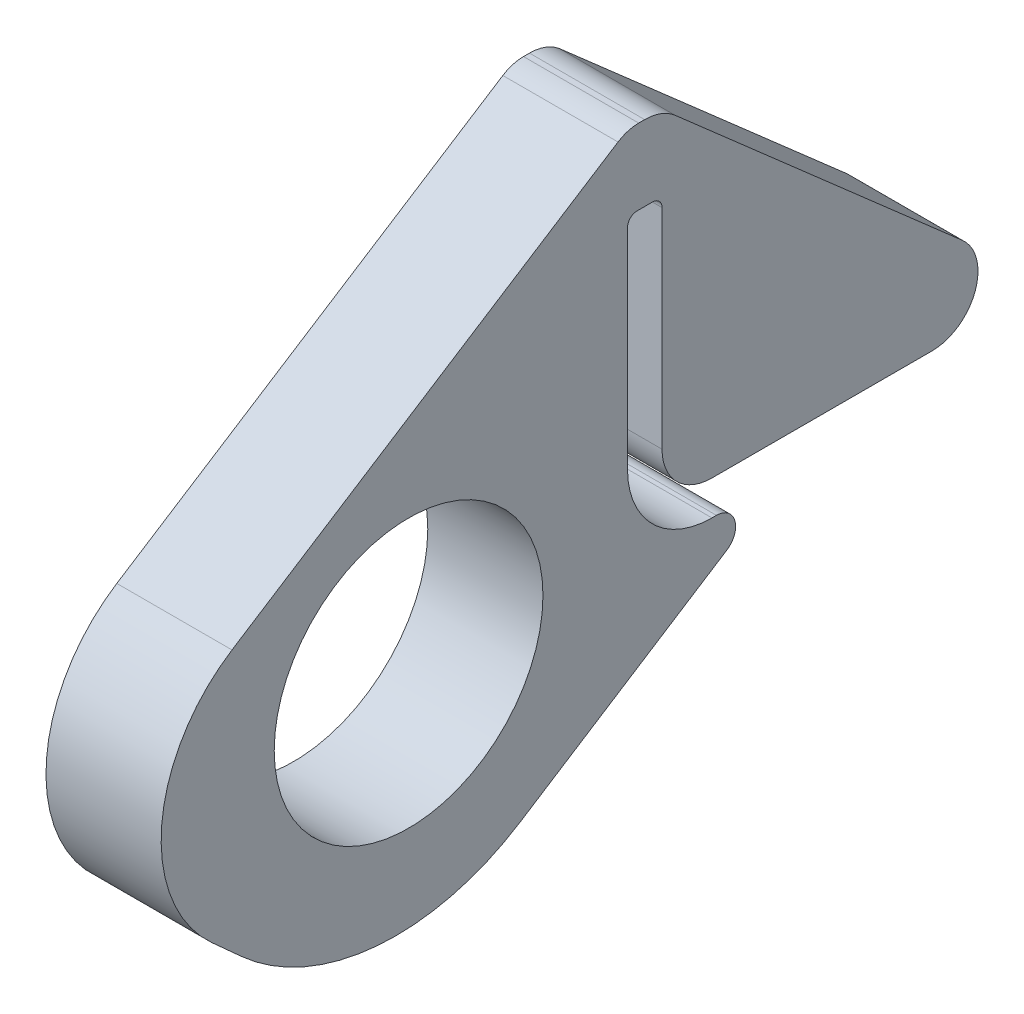
ISO-10303-21;
HEADER;
FILE_DESCRIPTION(('STEP AP214'),'2;1');
FILE_NAME('part.step','',(''),(''),'','','');
FILE_SCHEMA(('AUTOMOTIVE_DESIGN { 1 0 10303 214 1 1 1 1 }'));
ENDSEC;
DATA;
#1=APPLICATION_CONTEXT('core data for automotive mechanical design processes');
#2=APPLICATION_PROTOCOL_DEFINITION('international standard','automotive_design',2000,#1);
#3=PRODUCT_CONTEXT('',#1,'mechanical');
#4=PRODUCT('Part','Part','',(#3));
#5=PRODUCT_RELATED_PRODUCT_CATEGORY('part','',(#4));
#6=PRODUCT_DEFINITION_FORMATION('','',#4);
#7=PRODUCT_DEFINITION_CONTEXT('part definition',#1,'design');
#8=PRODUCT_DEFINITION('design','',#6,#7);
#9=PRODUCT_DEFINITION_SHAPE('','',#8);
#10=(LENGTH_UNIT() NAMED_UNIT(*) SI_UNIT(.MILLI.,.METRE.));
#11=(NAMED_UNIT(*) PLANE_ANGLE_UNIT() SI_UNIT($,.RADIAN.));
#12=(NAMED_UNIT(*) SI_UNIT($,.STERADIAN.) SOLID_ANGLE_UNIT());
#13=UNCERTAINTY_MEASURE_WITH_UNIT(LENGTH_MEASURE(1.E-05),#10,'distance_accuracy_value','');
#14=(GEOMETRIC_REPRESENTATION_CONTEXT(3) GLOBAL_UNCERTAINTY_ASSIGNED_CONTEXT((#13)) GLOBAL_UNIT_ASSIGNED_CONTEXT((#10,
#11,#12)) REPRESENTATION_CONTEXT('',''));
#15=CARTESIAN_POINT('',(0.,0.,0.));
#16=DIRECTION('',(0.,0.,1.));
#17=DIRECTION('',(1.,0.,0.));
#18=AXIS2_PLACEMENT_3D('',#15,#16,#17);
#19=CARTESIAN_POINT('',(3.,2.00000000000001,-2.00000000000001));
#20=DIRECTION('',(1.,0.,0.));
#21=DIRECTION('',(0.,0.,-1.));
#22=AXIS2_PLACEMENT_3D('',#19,#20,#21);
#23=PLANE('',#22);
#24=CARTESIAN_POINT('',(3.,2.00000000000001,-2.00000000000001));
#25=DIRECTION('',(1.,0.,0.));
#26=DIRECTION('',(0.,0.,-1.));
#27=AXIS2_PLACEMENT_3D('',#24,#25,#26);
#28=CIRCLE('',#27,1.30000000000001);
#29=CARTESIAN_POINT('',(3.,2.00000000000001,-0.700000000000001));
#30=VERTEX_POINT('',#29);
#31=CARTESIAN_POINT('',(3.,0.7,-2.00000000000001));
#32=VERTEX_POINT('',#31);
#33=EDGE_CURVE('E276',#30,#32,#28,.T.);
#34=ORIENTED_EDGE('',*,*,#33,.T.);
#35=DIRECTION('',(0.,0.,-1.));
#36=VECTOR('',#35,1.);
#37=CARTESIAN_POINT('',(3.,0.7,-7.72981651996982));
#38=LINE('',#37,#36);
#39=CARTESIAN_POINT('',(3.,0.7,-7.72981651996982));
#40=VERTEX_POINT('',#39);
#41=EDGE_CURVE('E140',#32,#40,#38,.T.);
#42=ORIENTED_EDGE('',*,*,#41,.T.);
#43=CARTESIAN_POINT('',(3.,1.9,-7.72981651996986));
#44=DIRECTION('',(1.,0.,0.));
#45=DIRECTION('',(0.,0.,1.));
#46=AXIS2_PLACEMENT_3D('',#43,#44,#45);
#47=CIRCLE('',#46,1.2);
#48=CARTESIAN_POINT('',(3.,2.80224816825759,-8.52098542916423));
#49=VERTEX_POINT('',#48);
#50=EDGE_CURVE('E345',#40,#49,#47,.T.);
#51=ORIENTED_EDGE('',*,*,#50,.T.);
#52=DIRECTION('',(0.,0.659307424328667,0.751873473547976));
#53=VECTOR('',#52,1.);
#54=CARTESIAN_POINT('',(3.,2.80224816825759,-8.52098542916423));
#55=LINE('',#54,#53);
#56=CARTESIAN_POINT('',(3.,9.36261002242814,-1.03955586684832));
#57=VERTEX_POINT('',#56);
#58=EDGE_CURVE('E365',#49,#57,#55,.T.);
#59=ORIENTED_EDGE('',*,*,#58,.T.);
#60=CARTESIAN_POINT('',(3.,8.46036185417057,-0.248386957653918));
#61=DIRECTION('',(1.,0.,0.));
#62=DIRECTION('',(0.,0.,-1.));
#63=AXIS2_PLACEMENT_3D('',#60,#61,#62);
#64=CIRCLE('',#63,1.2);
#65=CARTESIAN_POINT('',(3.,9.66036185417057,-0.248386957653913));
#66=VERTEX_POINT('',#65);
#67=EDGE_CURVE('E361',#57,#66,#64,.T.);
#68=ORIENTED_EDGE('',*,*,#67,.T.);
#69=DIRECTION('',(0.,0.,1.));
#70=VECTOR('',#69,1.);
#71=CARTESIAN_POINT('',(3.,9.66036185417057,-0.248386957653913));
#72=LINE('',#71,#70);
#73=CARTESIAN_POINT('',(3.,9.66036185417057,-0.0924135521783718));
#74=VERTEX_POINT('',#73);
#75=EDGE_CURVE('E364',#66,#74,#72,.T.);
#76=ORIENTED_EDGE('',*,*,#75,.T.);
#77=CARTESIAN_POINT('',(3.,8.66036185417057,-0.0924135521783679));
#78=DIRECTION('',(1.,0.,0.));
#79=DIRECTION('',(0.,0.,-1.));
#80=AXIS2_PLACEMENT_3D('',#77,#78,#79);
#81=CIRCLE('',#80,1.);
#82=CARTESIAN_POINT('',(3.,9.50282111230264,0.446346504235955));
#83=VERTEX_POINT('',#82);
#84=EDGE_CURVE('E369',#74,#83,#81,.T.);
#85=ORIENTED_EDGE('',*,*,#84,.T.);
#86=DIRECTION('',(0.,-0.53876005641432,0.842459258132071));
#87=VECTOR('',#86,1.);
#88=CARTESIAN_POINT('',(3.,9.50282111230264,0.446346504235955));
#89=LINE('',#88,#87);
#90=CARTESIAN_POINT('',(3.,3.07282255681129,10.500937130167));
#91=VERTEX_POINT('',#90);
#92=EDGE_CURVE('E376',#83,#91,#89,.T.);
#93=ORIENTED_EDGE('',*,*,#92,.T.);
#94=CARTESIAN_POINT('',(3.,-0.297014475717011,8.3458969045098));
#95=DIRECTION('',(1.,0.,0.));
#96=DIRECTION('',(0.,0.,-1.));
#97=AXIS2_PLACEMENT_3D('',#94,#95,#96);
#98=CIRCLE('',#97,4.);
#99=CARTESIAN_POINT('',(3.,-3.2640069349815,11.0286111544193));
#100=VERTEX_POINT('',#99);
#101=EDGE_CURVE('E379',#91,#100,#98,.T.);
#102=ORIENTED_EDGE('',*,*,#101,.T.);
#103=DIRECTION('',(0.,-0.670678562477389,-0.741748114816117));
#104=VECTOR('',#103,1.);
#105=CARTESIAN_POINT('',(3.,-3.96179883000111,10.2568765983708));
#106=LINE('',#105,#104);
#107=CARTESIAN_POINT('',(3.,-3.96179883000111,10.2568765983708));
#108=VERTEX_POINT('',#107);
#109=EDGE_CURVE('E382',#100,#108,#106,.T.);
#110=ORIENTED_EDGE('',*,*,#109,.T.);
#111=CARTESIAN_POINT('',(3.,0.488689858895568,6.23280522350644));
#112=DIRECTION('',(1.,0.,0.));
#113=DIRECTION('',(0.,0.,1.));
#114=AXIS2_PLACEMENT_3D('',#111,#112,#113);
#115=CIRCLE('',#114,6.);
#116=CARTESIAN_POINT('',(3.,-4.56606568989684,3.00024488502049));
#117=VERTEX_POINT('',#116);
#118=EDGE_CURVE('E385',#108,#117,#115,.T.);
#119=ORIENTED_EDGE('',*,*,#118,.T.);
#120=DIRECTION('',(0.,0.538760056414319,-0.842459258132071));
#121=VECTOR('',#120,1.);
#122=CARTESIAN_POINT('',(3.,-1.12122962906605,-2.38644627302316));
#123=LINE('',#122,#121);
#124=CARTESIAN_POINT('',(3.,-1.12122962906605,-2.38644627302316));
#125=VERTEX_POINT('',#124);
#126=EDGE_CURVE('E388',#117,#125,#123,.T.);
#127=ORIENTED_EDGE('',*,*,#126,.T.);
#128=CARTESIAN_POINT('',(3.,-0.7,-2.11706624481602));
#129=DIRECTION('',(1.,0.,0.));
#130=DIRECTION('',(0.,0.,1.));
#131=AXIS2_PLACEMENT_3D('',#128,#129,#130);
#132=CIRCLE('',#131,0.5);
#133=CARTESIAN_POINT('',(3.,-0.2,-2.117066244816));
#134=VERTEX_POINT('',#133);
#135=EDGE_CURVE('E391',#125,#134,#132,.T.);
#136=ORIENTED_EDGE('',*,*,#135,.T.);
#137=DIRECTION('',(0.,0.,1.));
#138=VECTOR('',#137,1.);
#139=CARTESIAN_POINT('',(3.,-0.2,-2.117066244816));
#140=LINE('',#139,#138);
#141=CARTESIAN_POINT('',(3.,-0.2,-2.00000000000001));
#142=VERTEX_POINT('',#141);
#143=EDGE_CURVE('E394',#134,#142,#140,.T.);
#144=ORIENTED_EDGE('',*,*,#143,.T.);
#145=CARTESIAN_POINT('',(3.,2.00000000000001,-2.00000000000001));
#146=DIRECTION('',(-1.,0.,0.));
#147=DIRECTION('',(0.,0.,-1.));
#148=AXIS2_PLACEMENT_3D('',#145,#146,#147);
#149=CIRCLE('',#148,2.20000000000001);
#150=CARTESIAN_POINT('',(3.,2.00000000000001,0.2));
#151=VERTEX_POINT('',#150);
#152=EDGE_CURVE('E397',#142,#151,#149,.T.);
#153=ORIENTED_EDGE('',*,*,#152,.T.);
#154=DIRECTION('',(0.,1.,0.));
#155=VECTOR('',#154,1.);
#156=CARTESIAN_POINT('',(3.,7.45000000000001,0.2));
#157=LINE('',#156,#155);
#158=CARTESIAN_POINT('',(3.,7.45000000000001,0.2));
#159=VERTEX_POINT('',#158);
#160=EDGE_CURVE('E400',#151,#159,#157,.T.);
#161=ORIENTED_EDGE('',*,*,#160,.T.);
#162=CARTESIAN_POINT('',(3.,7.45000000000001,-0.0499999999999998));
#163=DIRECTION('',(-1.,0.,0.));
#164=DIRECTION('',(0.,0.,-1.));
#165=AXIS2_PLACEMENT_3D('',#162,#163,#164);
#166=CIRCLE('',#165,0.25);
#167=CARTESIAN_POINT('',(3.,7.70000000000001,-0.0500000000000016));
#168=VERTEX_POINT('',#167);
#169=EDGE_CURVE('E195',#159,#168,#166,.T.);
#170=ORIENTED_EDGE('',*,*,#169,.T.);
#171=DIRECTION('',(0.,0.,-1.));
#172=VECTOR('',#171,1.);
#173=CARTESIAN_POINT('',(3.,7.70000000000001,-0.449999999999998));
#174=LINE('',#173,#172);
#175=CARTESIAN_POINT('',(3.,7.70000000000001,-0.449999999999998));
#176=VERTEX_POINT('',#175);
#177=EDGE_CURVE('E189',#168,#176,#174,.T.);
#178=ORIENTED_EDGE('',*,*,#177,.T.);
#179=CARTESIAN_POINT('',(3.,7.45000000000001,-0.45));
#180=DIRECTION('',(-1.,0.,0.));
#181=DIRECTION('',(0.,0.,-1.));
#182=AXIS2_PLACEMENT_3D('',#179,#180,#181);
#183=CIRCLE('',#182,0.25);
#184=CARTESIAN_POINT('',(3.,7.45000000000001,-0.7));
#185=VERTEX_POINT('',#184);
#186=EDGE_CURVE('E193',#176,#185,#183,.T.);
#187=ORIENTED_EDGE('',*,*,#186,.T.);
#188=DIRECTION('',(0.,-1.,0.));
#189=VECTOR('',#188,1.);
#190=CARTESIAN_POINT('',(3.,2.00000000000001,-0.700000000000001));
#191=LINE('',#190,#189);
#192=EDGE_CURVE('E61',#185,#30,#191,.T.);
#193=ORIENTED_EDGE('',*,*,#192,.T.);
#194=EDGE_LOOP('',(#34,#42,#51,#59,#68,#76,#85,#93,#102,#110,#119,#127,#136,#144,#153,#161,#170,
#178,#187,#193));
#195=FACE_BOUND('',#194,.T.);
#196=CARTESIAN_POINT('',(3.,0.25,5.90114305633939));
#197=DIRECTION('',(1.,0.,0.));
#198=DIRECTION('',(0.,0.,-1.));
#199=AXIS2_PLACEMENT_3D('',#196,#197,#198);
#200=CIRCLE('',#199,3.5);
#201=CARTESIAN_POINT('',(3.,0.25,2.4011430563394));
#202=VERTEX_POINT('',#201);
#203=EDGE_CURVE('E222',#202,#202,#200,.T.);
#204=ORIENTED_EDGE('',*,*,#203,.F.);
#205=EDGE_LOOP('',(#204));
#206=FACE_BOUND('',#205,.T.);
#207=ADVANCED_FACE('F43',(#195,#206),#23,.T.);
#208=CARTESIAN_POINT('',(0.,2.00000000000001,-2.00000000000001));
#209=DIRECTION('',(1.,0.,0.));
#210=DIRECTION('',(0.,0.,-1.));
#211=AXIS2_PLACEMENT_3D('',#208,#209,#210);
#212=PLANE('',#211);
#213=CARTESIAN_POINT('',(0.,2.00000000000001,-2.00000000000001));
#214=DIRECTION('',(1.,0.,0.));
#215=DIRECTION('',(0.,0.,-1.));
#216=AXIS2_PLACEMENT_3D('',#213,#214,#215);
#217=CIRCLE('',#216,1.30000000000001);
#218=CARTESIAN_POINT('',(0.,2.00000000000001,-0.700000000000001));
#219=VERTEX_POINT('',#218);
#220=CARTESIAN_POINT('',(0.,0.7,-2.00000000000001));
#221=VERTEX_POINT('',#220);
#222=EDGE_CURVE('E217',#219,#221,#217,.T.);
#223=ORIENTED_EDGE('',*,*,#222,.F.);
#224=DIRECTION('',(0.,-1.,0.));
#225=VECTOR('',#224,1.);
#226=CARTESIAN_POINT('',(0.,2.00000000000001,-0.700000000000001));
#227=LINE('',#226,#225);
#228=CARTESIAN_POINT('',(0.,7.45000000000001,-0.7));
#229=VERTEX_POINT('',#228);
#230=EDGE_CURVE('E132',#229,#219,#227,.T.);
#231=ORIENTED_EDGE('',*,*,#230,.F.);
#232=CARTESIAN_POINT('',(0.,7.45000000000001,-0.45));
#233=DIRECTION('',(-1.,0.,0.));
#234=DIRECTION('',(0.,0.,-1.));
#235=AXIS2_PLACEMENT_3D('',#232,#233,#234);
#236=CIRCLE('',#235,0.25);
#237=CARTESIAN_POINT('',(0.,7.70000000000001,-0.449999999999998));
#238=VERTEX_POINT('',#237);
#239=EDGE_CURVE('E126',#238,#229,#236,.T.);
#240=ORIENTED_EDGE('',*,*,#239,.F.);
#241=DIRECTION('',(0.,0.,-1.));
#242=VECTOR('',#241,1.);
#243=CARTESIAN_POINT('',(0.,7.70000000000001,-0.449999999999998));
#244=LINE('',#243,#242);
#245=CARTESIAN_POINT('',(0.,7.70000000000001,-0.0500000000000016));
#246=VERTEX_POINT('',#245);
#247=EDGE_CURVE('E204',#246,#238,#244,.T.);
#248=ORIENTED_EDGE('',*,*,#247,.F.);
#249=CARTESIAN_POINT('',(0.,7.45000000000001,-0.0499999999999998));
#250=DIRECTION('',(-1.,0.,0.));
#251=DIRECTION('',(0.,0.,-1.));
#252=AXIS2_PLACEMENT_3D('',#249,#250,#251);
#253=CIRCLE('',#252,0.25);
#254=CARTESIAN_POINT('',(0.,7.45000000000001,0.2));
#255=VERTEX_POINT('',#254);
#256=EDGE_CURVE('E267',#255,#246,#253,.T.);
#257=ORIENTED_EDGE('',*,*,#256,.F.);
#258=DIRECTION('',(0.,1.,0.));
#259=VECTOR('',#258,1.);
#260=CARTESIAN_POINT('',(0.,7.45000000000001,0.2));
#261=LINE('',#260,#259);
#262=CARTESIAN_POINT('',(0.,2.00000000000001,0.2));
#263=VERTEX_POINT('',#262);
#264=EDGE_CURVE('E264',#263,#255,#261,.T.);
#265=ORIENTED_EDGE('',*,*,#264,.F.);
#266=CARTESIAN_POINT('',(0.,2.00000000000001,-2.00000000000001));
#267=DIRECTION('',(-1.,0.,0.));
#268=DIRECTION('',(0.,0.,-1.));
#269=AXIS2_PLACEMENT_3D('',#266,#267,#268);
#270=CIRCLE('',#269,2.20000000000001);
#271=CARTESIAN_POINT('',(0.,-0.2,-2.00000000000001));
#272=VERTEX_POINT('',#271);
#273=EDGE_CURVE('E261',#272,#263,#270,.T.);
#274=ORIENTED_EDGE('',*,*,#273,.F.);
#275=DIRECTION('',(0.,0.,1.));
#276=VECTOR('',#275,1.);
#277=CARTESIAN_POINT('',(0.,-0.2,-2.117066244816));
#278=LINE('',#277,#276);
#279=CARTESIAN_POINT('',(0.,-0.2,-2.117066244816));
#280=VERTEX_POINT('',#279);
#281=EDGE_CURVE('E258',#280,#272,#278,.T.);
#282=ORIENTED_EDGE('',*,*,#281,.F.);
#283=CARTESIAN_POINT('',(0.,-0.7,-2.11706624481602));
#284=DIRECTION('',(1.,0.,0.));
#285=DIRECTION('',(0.,0.,1.));
#286=AXIS2_PLACEMENT_3D('',#283,#284,#285);
#287=CIRCLE('',#286,0.5);
#288=CARTESIAN_POINT('',(0.,-1.12122962906605,-2.38644627302316));
#289=VERTEX_POINT('',#288);
#290=EDGE_CURVE('E255',#289,#280,#287,.T.);
#291=ORIENTED_EDGE('',*,*,#290,.F.);
#292=DIRECTION('',(0.,0.538760056414319,-0.842459258132071));
#293=VECTOR('',#292,1.);
#294=CARTESIAN_POINT('',(0.,-1.12122962906605,-2.38644627302316));
#295=LINE('',#294,#293);
#296=CARTESIAN_POINT('',(0.,-4.56606568989684,3.00024488502049));
#297=VERTEX_POINT('',#296);
#298=EDGE_CURVE('E252',#297,#289,#295,.T.);
#299=ORIENTED_EDGE('',*,*,#298,.F.);
#300=CARTESIAN_POINT('',(0.,0.488689858895568,6.23280522350644));
#301=DIRECTION('',(1.,0.,0.));
#302=DIRECTION('',(0.,0.,1.));
#303=AXIS2_PLACEMENT_3D('',#300,#301,#302);
#304=CIRCLE('',#303,6.);
#305=CARTESIAN_POINT('',(0.,-3.96179883000111,10.2568765983708));
#306=VERTEX_POINT('',#305);
#307=EDGE_CURVE('E249',#306,#297,#304,.T.);
#308=ORIENTED_EDGE('',*,*,#307,.F.);
#309=DIRECTION('',(0.,-0.670678562477389,-0.741748114816117));
#310=VECTOR('',#309,1.);
#311=CARTESIAN_POINT('',(0.,-3.96179883000111,10.2568765983708));
#312=LINE('',#311,#310);
#313=CARTESIAN_POINT('',(0.,-3.2640069349815,11.0286111544193));
#314=VERTEX_POINT('',#313);
#315=EDGE_CURVE('E246',#314,#306,#312,.T.);
#316=ORIENTED_EDGE('',*,*,#315,.F.);
#317=CARTESIAN_POINT('',(0.,-0.297014475717011,8.3458969045098));
#318=DIRECTION('',(1.,0.,0.));
#319=DIRECTION('',(0.,0.,-1.));
#320=AXIS2_PLACEMENT_3D('',#317,#318,#319);
#321=CIRCLE('',#320,4.);
#322=CARTESIAN_POINT('',(0.,3.07282255681129,10.500937130167));
#323=VERTEX_POINT('',#322);
#324=EDGE_CURVE('E243',#323,#314,#321,.T.);
#325=ORIENTED_EDGE('',*,*,#324,.F.);
#326=DIRECTION('',(0.,-0.53876005641432,0.842459258132071));
#327=VECTOR('',#326,1.);
#328=CARTESIAN_POINT('',(0.,9.50282111230264,0.446346504235955));
#329=LINE('',#328,#327);
#330=CARTESIAN_POINT('',(0.,9.50282111230264,0.446346504235955));
#331=VERTEX_POINT('',#330);
#332=EDGE_CURVE('E240',#331,#323,#329,.T.);
#333=ORIENTED_EDGE('',*,*,#332,.F.);
#334=CARTESIAN_POINT('',(0.,8.66036185417057,-0.0924135521783679));
#335=DIRECTION('',(1.,0.,0.));
#336=DIRECTION('',(0.,0.,-1.));
#337=AXIS2_PLACEMENT_3D('',#334,#335,#336);
#338=CIRCLE('',#337,1.);
#339=CARTESIAN_POINT('',(0.,9.66036185417057,-0.0924135521783718));
#340=VERTEX_POINT('',#339);
#341=EDGE_CURVE('E237',#340,#331,#338,.T.);
#342=ORIENTED_EDGE('',*,*,#341,.F.);
#343=DIRECTION('',(0.,0.,1.));
#344=VECTOR('',#343,1.);
#345=CARTESIAN_POINT('',(0.,9.66036185417057,-0.248386957653913));
#346=LINE('',#345,#344);
#347=CARTESIAN_POINT('',(0.,9.66036185417057,-0.248386957653913));
#348=VERTEX_POINT('',#347);
#349=EDGE_CURVE('E234',#348,#340,#346,.T.);
#350=ORIENTED_EDGE('',*,*,#349,.F.);
#351=CARTESIAN_POINT('',(0.,8.46036185417057,-0.248386957653918));
#352=DIRECTION('',(1.,0.,0.));
#353=DIRECTION('',(0.,0.,-1.));
#354=AXIS2_PLACEMENT_3D('',#351,#352,#353);
#355=CIRCLE('',#354,1.2);
#356=CARTESIAN_POINT('',(0.,9.36261002242814,-1.03955586684832));
#357=VERTEX_POINT('',#356);
#358=EDGE_CURVE('E231',#357,#348,#355,.T.);
#359=ORIENTED_EDGE('',*,*,#358,.F.);
#360=DIRECTION('',(0.,0.659307424328667,0.751873473547976));
#361=VECTOR('',#360,1.);
#362=CARTESIAN_POINT('',(0.,2.80224816825759,-8.52098542916423));
#363=LINE('',#362,#361);
#364=CARTESIAN_POINT('',(0.,2.80224816825759,-8.52098542916423));
#365=VERTEX_POINT('',#364);
#366=EDGE_CURVE('E228',#365,#357,#363,.T.);
#367=ORIENTED_EDGE('',*,*,#366,.F.);
#368=CARTESIAN_POINT('',(0.,1.9,-7.72981651996986));
#369=DIRECTION('',(1.,0.,0.));
#370=DIRECTION('',(0.,0.,1.));
#371=AXIS2_PLACEMENT_3D('',#368,#369,#370);
#372=CIRCLE('',#371,1.2);
#373=CARTESIAN_POINT('',(0.,0.7,-7.72981651996982));
#374=VERTEX_POINT('',#373);
#375=EDGE_CURVE('E225',#374,#365,#372,.T.);
#376=ORIENTED_EDGE('',*,*,#375,.F.);
#377=DIRECTION('',(0.,0.,-1.));
#378=VECTOR('',#377,1.);
#379=CARTESIAN_POINT('',(0.,0.7,-7.72981651996982));
#380=LINE('',#379,#378);
#381=EDGE_CURVE('E221',#221,#374,#380,.T.);
#382=ORIENTED_EDGE('',*,*,#381,.F.);
#383=EDGE_LOOP('',(#223,#231,#240,#248,#257,#265,#274,#282,#291,#299,#308,#316,#325,#333,#342,
#350,#359,#367,#376,#382));
#384=FACE_BOUND('',#383,.T.);
#385=CARTESIAN_POINT('',(0.,0.25,5.90114305633939));
#386=DIRECTION('',(1.,0.,0.));
#387=DIRECTION('',(0.,0.,-1.));
#388=AXIS2_PLACEMENT_3D('',#385,#386,#387);
#389=CIRCLE('',#388,3.5);
#390=CARTESIAN_POINT('',(0.,0.25,2.4011430563394));
#391=VERTEX_POINT('',#390);
#392=EDGE_CURVE('E699',#391,#391,#389,.T.);
#393=ORIENTED_EDGE('',*,*,#392,.T.);
#394=EDGE_LOOP('',(#393));
#395=FACE_BOUND('',#394,.T.);
#396=ADVANCED_FACE('F349',(#384,#395),#212,.F.);
#397=CARTESIAN_POINT('',(3.,2.00000000000001,-2.00000000000001));
#398=DIRECTION('',(-1.,0.,0.));
#399=DIRECTION('',(0.,0.,1.));
#400=AXIS2_PLACEMENT_3D('',#397,#398,#399);
#401=CYLINDRICAL_SURFACE('',#400,1.30000000000001);
#402=ORIENTED_EDGE('',*,*,#222,.T.);
#403=DIRECTION('',(-1.,0.,0.));
#404=VECTOR('',#403,1.);
#405=CARTESIAN_POINT('',(3.,0.7,-2.00000000000001));
#406=LINE('',#405,#404);
#407=EDGE_CURVE('E11',#32,#221,#406,.T.);
#408=ORIENTED_EDGE('',*,*,#407,.F.);
#409=ORIENTED_EDGE('',*,*,#33,.F.);
#410=DIRECTION('',(-1.,0.,0.));
#411=VECTOR('',#410,1.);
#412=CARTESIAN_POINT('',(3.,2.00000000000001,-0.700000000000001));
#413=LINE('',#412,#411);
#414=EDGE_CURVE('E213',#30,#219,#413,.T.);
#415=ORIENTED_EDGE('',*,*,#414,.T.);
#416=EDGE_LOOP('',(#402,#408,#409,#415));
#417=FACE_BOUND('',#416,.T.);
#418=ADVANCED_FACE('F45',(#417),#401,.T.);
#419=CARTESIAN_POINT('',(3.,0.7,-7.72981651996982));
#420=DIRECTION('',(0.,1.,0.));
#421=DIRECTION('',(0.,0.,1.));
#422=AXIS2_PLACEMENT_3D('',#419,#420,#421);
#423=PLANE('',#422);
#424=ORIENTED_EDGE('',*,*,#381,.T.);
#425=DIRECTION('',(-1.,0.,0.));
#426=VECTOR('',#425,1.);
#427=CARTESIAN_POINT('',(3.,0.7,-7.72981651996982));
#428=LINE('',#427,#426);
#429=EDGE_CURVE('E53',#40,#374,#428,.T.);
#430=ORIENTED_EDGE('',*,*,#429,.F.);
#431=ORIENTED_EDGE('',*,*,#41,.F.);
#432=ORIENTED_EDGE('',*,*,#407,.T.);
#433=EDGE_LOOP('',(#424,#430,#431,#432));
#434=FACE_BOUND('',#433,.T.);
#435=ADVANCED_FACE('F436',(#434),#423,.F.);
#436=CARTESIAN_POINT('',(3.,1.9,-7.72981651996986));
#437=DIRECTION('',(-1.,0.,0.));
#438=DIRECTION('',(0.,0.,1.));
#439=AXIS2_PLACEMENT_3D('',#436,#437,#438);
#440=CYLINDRICAL_SURFACE('',#439,1.2);
#441=ORIENTED_EDGE('',*,*,#375,.T.);
#442=DIRECTION('',(-1.,0.,0.));
#443=VECTOR('',#442,1.);
#444=CARTESIAN_POINT('',(3.,2.80224816825759,-8.52098542916423));
#445=LINE('',#444,#443);
#446=EDGE_CURVE('E335',#49,#365,#445,.T.);
#447=ORIENTED_EDGE('',*,*,#446,.F.);
#448=ORIENTED_EDGE('',*,*,#50,.F.);
#449=ORIENTED_EDGE('',*,*,#429,.T.);
#450=EDGE_LOOP('',(#441,#447,#448,#449));
#451=FACE_BOUND('',#450,.T.);
#452=ADVANCED_FACE('F343',(#451),#440,.T.);
#453=CARTESIAN_POINT('',(3.,2.80224816825759,-8.52098542916423));
#454=DIRECTION('',(0.,-0.751873473547976,0.659307424328667));
#455=DIRECTION('',(0.,-0.659307424328667,-0.751873473547976));
#456=AXIS2_PLACEMENT_3D('',#453,#454,#455);
#457=PLANE('',#456);
#458=ORIENTED_EDGE('',*,*,#366,.T.);
#459=DIRECTION('',(-1.,0.,0.));
#460=VECTOR('',#459,1.);
#461=CARTESIAN_POINT('',(3.,9.36261002242814,-1.03955586684832));
#462=LINE('',#461,#460);
#463=EDGE_CURVE('E331',#57,#357,#462,.T.);
#464=ORIENTED_EDGE('',*,*,#463,.F.);
#465=ORIENTED_EDGE('',*,*,#58,.F.);
#466=ORIENTED_EDGE('',*,*,#446,.T.);
#467=EDGE_LOOP('',(#458,#464,#465,#466));
#468=FACE_BOUND('',#467,.T.);
#469=ADVANCED_FACE('F355',(#468),#457,.F.);
#470=CARTESIAN_POINT('',(3.,8.46036185417057,-0.248386957653918));
#471=DIRECTION('',(-1.,0.,0.));
#472=DIRECTION('',(0.,0.,1.));
#473=AXIS2_PLACEMENT_3D('',#470,#471,#472);
#474=CYLINDRICAL_SURFACE('',#473,1.2);
#475=ORIENTED_EDGE('',*,*,#358,.T.);
#476=DIRECTION('',(-1.,0.,0.));
#477=VECTOR('',#476,1.);
#478=CARTESIAN_POINT('',(3.,9.66036185417057,-0.248386957653913));
#479=LINE('',#478,#477);
#480=EDGE_CURVE('E327',#66,#348,#479,.T.);
#481=ORIENTED_EDGE('',*,*,#480,.F.);
#482=ORIENTED_EDGE('',*,*,#67,.F.);
#483=ORIENTED_EDGE('',*,*,#463,.T.);
#484=EDGE_LOOP('',(#475,#481,#482,#483));
#485=FACE_BOUND('',#484,.T.);
#486=ADVANCED_FACE('F359',(#485),#474,.T.);
#487=CARTESIAN_POINT('',(3.,9.66036185417057,-0.248386957653913));
#488=DIRECTION('',(0.,-1.,0.));
#489=DIRECTION('',(0.,0.,-1.));
#490=AXIS2_PLACEMENT_3D('',#487,#488,#489);
#491=PLANE('',#490);
#492=ORIENTED_EDGE('',*,*,#349,.T.);
#493=DIRECTION('',(-1.,0.,0.));
#494=VECTOR('',#493,1.);
#495=CARTESIAN_POINT('',(3.,9.66036185417057,-0.0924135521783718));
#496=LINE('',#495,#494);
#497=EDGE_CURVE('E323',#74,#340,#496,.T.);
#498=ORIENTED_EDGE('',*,*,#497,.F.);
#499=ORIENTED_EDGE('',*,*,#75,.F.);
#500=ORIENTED_EDGE('',*,*,#480,.T.);
#501=EDGE_LOOP('',(#492,#498,#499,#500));
#502=FACE_BOUND('',#501,.T.);
#503=ADVANCED_FACE('F449',(#502),#491,.F.);
#504=CARTESIAN_POINT('',(3.,8.66036185417057,-0.0924135521783679));
#505=DIRECTION('',(-1.,0.,0.));
#506=DIRECTION('',(0.,0.,1.));
#507=AXIS2_PLACEMENT_3D('',#504,#505,#506);
#508=CYLINDRICAL_SURFACE('',#507,1.);
#509=ORIENTED_EDGE('',*,*,#341,.T.);
#510=DIRECTION('',(-1.,0.,0.));
#511=VECTOR('',#510,1.);
#512=CARTESIAN_POINT('',(3.,9.50282111230264,0.446346504235955));
#513=LINE('',#512,#511);
#514=EDGE_CURVE('E319',#83,#331,#513,.T.);
#515=ORIENTED_EDGE('',*,*,#514,.F.);
#516=ORIENTED_EDGE('',*,*,#84,.F.);
#517=ORIENTED_EDGE('',*,*,#497,.T.);
#518=EDGE_LOOP('',(#509,#515,#516,#517));
#519=FACE_BOUND('',#518,.T.);
#520=ADVANCED_FACE('F452',(#519),#508,.T.);
#521=CARTESIAN_POINT('',(3.,9.50282111230264,0.446346504235955));
#522=DIRECTION('',(0.,-0.842459258132071,-0.53876005641432));
#523=DIRECTION('',(0.,0.53876005641432,-0.842459258132071));
#524=AXIS2_PLACEMENT_3D('',#521,#522,#523);
#525=PLANE('',#524);
#526=ORIENTED_EDGE('',*,*,#332,.T.);
#527=DIRECTION('',(-1.,0.,0.));
#528=VECTOR('',#527,1.);
#529=CARTESIAN_POINT('',(3.,3.07282255681129,10.500937130167));
#530=LINE('',#529,#528);
#531=EDGE_CURVE('E315',#91,#323,#530,.T.);
#532=ORIENTED_EDGE('',*,*,#531,.F.);
#533=ORIENTED_EDGE('',*,*,#92,.F.);
#534=ORIENTED_EDGE('',*,*,#514,.T.);
#535=EDGE_LOOP('',(#526,#532,#533,#534));
#536=FACE_BOUND('',#535,.T.);
#537=ADVANCED_FACE('F456',(#536),#525,.F.);
#538=CARTESIAN_POINT('',(3.,-0.297014475717011,8.3458969045098));
#539=DIRECTION('',(-1.,0.,0.));
#540=DIRECTION('',(0.,0.,1.));
#541=AXIS2_PLACEMENT_3D('',#538,#539,#540);
#542=CYLINDRICAL_SURFACE('',#541,4.);
#543=ORIENTED_EDGE('',*,*,#324,.T.);
#544=DIRECTION('',(-1.,0.,0.));
#545=VECTOR('',#544,1.);
#546=CARTESIAN_POINT('',(3.,-3.2640069349815,11.0286111544193));
#547=LINE('',#546,#545);
#548=EDGE_CURVE('E311',#100,#314,#547,.T.);
#549=ORIENTED_EDGE('',*,*,#548,.F.);
#550=ORIENTED_EDGE('',*,*,#101,.F.);
#551=ORIENTED_EDGE('',*,*,#531,.T.);
#552=EDGE_LOOP('',(#543,#549,#550,#551));
#553=FACE_BOUND('',#552,.T.);
#554=ADVANCED_FACE('F460',(#553),#542,.T.);
#555=CARTESIAN_POINT('',(3.,-3.96179883000111,10.2568765983708));
#556=DIRECTION('',(0.,0.741748114816117,-0.670678562477389));
#557=DIRECTION('',(0.,0.670678562477389,0.741748114816117));
#558=AXIS2_PLACEMENT_3D('',#555,#556,#557);
#559=PLANE('',#558);
#560=ORIENTED_EDGE('',*,*,#315,.T.);
#561=DIRECTION('',(-1.,0.,0.));
#562=VECTOR('',#561,1.);
#563=CARTESIAN_POINT('',(3.,-3.96179883000111,10.2568765983708));
#564=LINE('',#563,#562);
#565=EDGE_CURVE('E307',#108,#306,#564,.T.);
#566=ORIENTED_EDGE('',*,*,#565,.F.);
#567=ORIENTED_EDGE('',*,*,#109,.F.);
#568=ORIENTED_EDGE('',*,*,#548,.T.);
#569=EDGE_LOOP('',(#560,#566,#567,#568));
#570=FACE_BOUND('',#569,.T.);
#571=ADVANCED_FACE('F464',(#570),#559,.F.);
#572=CARTESIAN_POINT('',(3.,0.488689858895568,6.23280522350644));
#573=DIRECTION('',(-1.,0.,0.));
#574=DIRECTION('',(0.,0.,1.));
#575=AXIS2_PLACEMENT_3D('',#572,#573,#574);
#576=CYLINDRICAL_SURFACE('',#575,6.);
#577=ORIENTED_EDGE('',*,*,#307,.T.);
#578=DIRECTION('',(-1.,0.,0.));
#579=VECTOR('',#578,1.);
#580=CARTESIAN_POINT('',(3.,-4.56606568989684,3.00024488502049));
#581=LINE('',#580,#579);
#582=EDGE_CURVE('E303',#117,#297,#581,.T.);
#583=ORIENTED_EDGE('',*,*,#582,.F.);
#584=ORIENTED_EDGE('',*,*,#118,.F.);
#585=ORIENTED_EDGE('',*,*,#565,.T.);
#586=EDGE_LOOP('',(#577,#583,#584,#585));
#587=FACE_BOUND('',#586,.T.);
#588=ADVANCED_FACE('F468',(#587),#576,.T.);
#589=CARTESIAN_POINT('',(3.,-1.12122962906605,-2.38644627302316));
#590=DIRECTION('',(0.,0.842459258132071,0.538760056414319));
#591=DIRECTION('',(0.,-0.538760056414319,0.842459258132071));
#592=AXIS2_PLACEMENT_3D('',#589,#590,#591);
#593=PLANE('',#592);
#594=ORIENTED_EDGE('',*,*,#298,.T.);
#595=DIRECTION('',(-1.,0.,0.));
#596=VECTOR('',#595,1.);
#597=CARTESIAN_POINT('',(3.,-1.12122962906605,-2.38644627302316));
#598=LINE('',#597,#596);
#599=EDGE_CURVE('E299',#125,#289,#598,.T.);
#600=ORIENTED_EDGE('',*,*,#599,.F.);
#601=ORIENTED_EDGE('',*,*,#126,.F.);
#602=ORIENTED_EDGE('',*,*,#582,.T.);
#603=EDGE_LOOP('',(#594,#600,#601,#602));
#604=FACE_BOUND('',#603,.T.);
#605=ADVANCED_FACE('F472',(#604),#593,.F.);
#606=CARTESIAN_POINT('',(3.,-0.7,-2.11706624481602));
#607=DIRECTION('',(-1.,0.,0.));
#608=DIRECTION('',(0.,0.,1.));
#609=AXIS2_PLACEMENT_3D('',#606,#607,#608);
#610=CYLINDRICAL_SURFACE('',#609,0.5);
#611=ORIENTED_EDGE('',*,*,#290,.T.);
#612=DIRECTION('',(-1.,0.,0.));
#613=VECTOR('',#612,1.);
#614=CARTESIAN_POINT('',(3.,-0.2,-2.117066244816));
#615=LINE('',#614,#613);
#616=EDGE_CURVE('E295',#134,#280,#615,.T.);
#617=ORIENTED_EDGE('',*,*,#616,.F.);
#618=ORIENTED_EDGE('',*,*,#135,.F.);
#619=ORIENTED_EDGE('',*,*,#599,.T.);
#620=EDGE_LOOP('',(#611,#617,#618,#619));
#621=FACE_BOUND('',#620,.T.);
#622=ADVANCED_FACE('F476',(#621),#610,.T.);
#623=CARTESIAN_POINT('',(3.,-0.2,-2.117066244816));
#624=DIRECTION('',(0.,-1.,0.));
#625=DIRECTION('',(0.,0.,-1.));
#626=AXIS2_PLACEMENT_3D('',#623,#624,#625);
#627=PLANE('',#626);
#628=ORIENTED_EDGE('',*,*,#281,.T.);
#629=DIRECTION('',(-1.,0.,0.));
#630=VECTOR('',#629,1.);
#631=CARTESIAN_POINT('',(3.,-0.2,-2.00000000000001));
#632=LINE('',#631,#630);
#633=EDGE_CURVE('E291',#142,#272,#632,.T.);
#634=ORIENTED_EDGE('',*,*,#633,.F.);
#635=ORIENTED_EDGE('',*,*,#143,.F.);
#636=ORIENTED_EDGE('',*,*,#616,.T.);
#637=EDGE_LOOP('',(#628,#634,#635,#636));
#638=FACE_BOUND('',#637,.T.);
#639=ADVANCED_FACE('F480',(#638),#627,.F.);
#640=CARTESIAN_POINT('',(3.,2.00000000000001,-2.00000000000001));
#641=DIRECTION('',(-1.,0.,0.));
#642=DIRECTION('',(0.,0.,1.));
#643=AXIS2_PLACEMENT_3D('',#640,#641,#642);
#644=CYLINDRICAL_SURFACE('',#643,2.20000000000001);
#645=ORIENTED_EDGE('',*,*,#273,.T.);
#646=DIRECTION('',(-1.,0.,0.));
#647=VECTOR('',#646,1.);
#648=CARTESIAN_POINT('',(3.,2.00000000000001,0.2));
#649=LINE('',#648,#647);
#650=EDGE_CURVE('E287',#151,#263,#649,.T.);
#651=ORIENTED_EDGE('',*,*,#650,.F.);
#652=ORIENTED_EDGE('',*,*,#152,.F.);
#653=ORIENTED_EDGE('',*,*,#633,.T.);
#654=EDGE_LOOP('',(#645,#651,#652,#653));
#655=FACE_BOUND('',#654,.T.);
#656=ADVANCED_FACE('F484',(#655),#644,.F.);
#657=CARTESIAN_POINT('',(3.,7.45000000000001,0.2));
#658=DIRECTION('',(0.,0.,1.));
#659=DIRECTION('',(1.,0.,0.));
#660=AXIS2_PLACEMENT_3D('',#657,#658,#659);
#661=PLANE('',#660);
#662=ORIENTED_EDGE('',*,*,#264,.T.);
#663=DIRECTION('',(-1.,0.,0.));
#664=VECTOR('',#663,1.);
#665=CARTESIAN_POINT('',(3.,7.45000000000001,0.2));
#666=LINE('',#665,#664);
#667=EDGE_CURVE('E283',#159,#255,#666,.T.);
#668=ORIENTED_EDGE('',*,*,#667,.F.);
#669=ORIENTED_EDGE('',*,*,#160,.F.);
#670=ORIENTED_EDGE('',*,*,#650,.T.);
#671=EDGE_LOOP('',(#662,#668,#669,#670));
#672=FACE_BOUND('',#671,.T.);
#673=ADVANCED_FACE('F408',(#672),#661,.F.);
#674=CARTESIAN_POINT('',(3.,7.45000000000001,-0.0499999999999998));
#675=DIRECTION('',(-1.,0.,0.));
#676=DIRECTION('',(0.,0.,1.));
#677=AXIS2_PLACEMENT_3D('',#674,#675,#676);
#678=CYLINDRICAL_SURFACE('',#677,0.25);
#679=ORIENTED_EDGE('',*,*,#256,.T.);
#680=DIRECTION('',(-1.,0.,0.));
#681=VECTOR('',#680,1.);
#682=CARTESIAN_POINT('',(3.,7.70000000000001,-0.0500000000000016));
#683=LINE('',#682,#681);
#684=EDGE_CURVE('E206',#168,#246,#683,.T.);
#685=ORIENTED_EDGE('',*,*,#684,.F.);
#686=ORIENTED_EDGE('',*,*,#169,.F.);
#687=ORIENTED_EDGE('',*,*,#667,.T.);
#688=EDGE_LOOP('',(#679,#685,#686,#687));
#689=FACE_BOUND('',#688,.T.);
#690=ADVANCED_FACE('F412',(#689),#678,.F.);
#691=CARTESIAN_POINT('',(3.,7.70000000000001,-0.449999999999998));
#692=DIRECTION('',(0.,1.,0.));
#693=DIRECTION('',(0.,0.,1.));
#694=AXIS2_PLACEMENT_3D('',#691,#692,#693);
#695=PLANE('',#694);
#696=ORIENTED_EDGE('',*,*,#247,.T.);
#697=DIRECTION('',(-1.,0.,0.));
#698=VECTOR('',#697,1.);
#699=CARTESIAN_POINT('',(3.,7.70000000000001,-0.449999999999998));
#700=LINE('',#699,#698);
#701=EDGE_CURVE('E201',#176,#238,#700,.T.);
#702=ORIENTED_EDGE('',*,*,#701,.F.);
#703=ORIENTED_EDGE('',*,*,#177,.F.);
#704=ORIENTED_EDGE('',*,*,#684,.T.);
#705=EDGE_LOOP('',(#696,#702,#703,#704));
#706=FACE_BOUND('',#705,.T.);
#707=ADVANCED_FACE('F202',(#706),#695,.F.);
#708=CARTESIAN_POINT('',(3.,7.45000000000001,-0.45));
#709=DIRECTION('',(-1.,0.,0.));
#710=DIRECTION('',(0.,0.,1.));
#711=AXIS2_PLACEMENT_3D('',#708,#709,#710);
#712=CYLINDRICAL_SURFACE('',#711,0.25);
#713=ORIENTED_EDGE('',*,*,#239,.T.);
#714=DIRECTION('',(-1.,0.,0.));
#715=VECTOR('',#714,1.);
#716=CARTESIAN_POINT('',(3.,7.45000000000001,-0.7));
#717=LINE('',#716,#715);
#718=EDGE_CURVE('E207',#185,#229,#717,.T.);
#719=ORIENTED_EDGE('',*,*,#718,.F.);
#720=ORIENTED_EDGE('',*,*,#186,.F.);
#721=ORIENTED_EDGE('',*,*,#701,.T.);
#722=EDGE_LOOP('',(#713,#719,#720,#721));
#723=FACE_BOUND('',#722,.T.);
#724=ADVANCED_FACE('F209',(#723),#712,.F.);
#725=CARTESIAN_POINT('',(3.,2.00000000000001,-0.700000000000001));
#726=DIRECTION('',(0.,0.,-1.));
#727=DIRECTION('',(0.,1.,0.));
#728=AXIS2_PLACEMENT_3D('',#725,#726,#727);
#729=PLANE('',#728);
#730=ORIENTED_EDGE('',*,*,#230,.T.);
#731=ORIENTED_EDGE('',*,*,#414,.F.);
#732=ORIENTED_EDGE('',*,*,#192,.F.);
#733=ORIENTED_EDGE('',*,*,#718,.T.);
#734=EDGE_LOOP('',(#730,#731,#732,#733));
#735=FACE_BOUND('',#734,.T.);
#736=ADVANCED_FACE('F416',(#735),#729,.F.);
#737=CARTESIAN_POINT('',(3.,0.25,5.90114305633939));
#738=DIRECTION('',(-1.,0.,0.));
#739=DIRECTION('',(0.,0.,1.));
#740=AXIS2_PLACEMENT_3D('',#737,#738,#739);
#741=CYLINDRICAL_SURFACE('',#740,3.5);
#742=ORIENTED_EDGE('',*,*,#203,.T.);
#743=EDGE_LOOP('',(#742));
#744=FACE_BOUND('',#743,.T.);
#745=ORIENTED_EDGE('',*,*,#392,.F.);
#746=EDGE_LOOP('',(#745));
#747=FACE_BOUND('',#746,.T.);
#748=ADVANCED_FACE('F418',(#744,#747),#741,.F.);
#749=CLOSED_SHELL('',(#207,#396,#418,#435,#452,#469,#486,#503,#520,#537,#554,#571,#588,#605,
#622,#639,#656,#673,#690,#707,#724,#736,#748));
#750=MANIFOLD_SOLID_BREP('B2',#749);
#751=ADVANCED_BREP_SHAPE_REPRESENTATION('',(#18,#750),#14);
#752=SHAPE_DEFINITION_REPRESENTATION(#9,#751);
ENDSEC;
END-ISO-10303-21;
